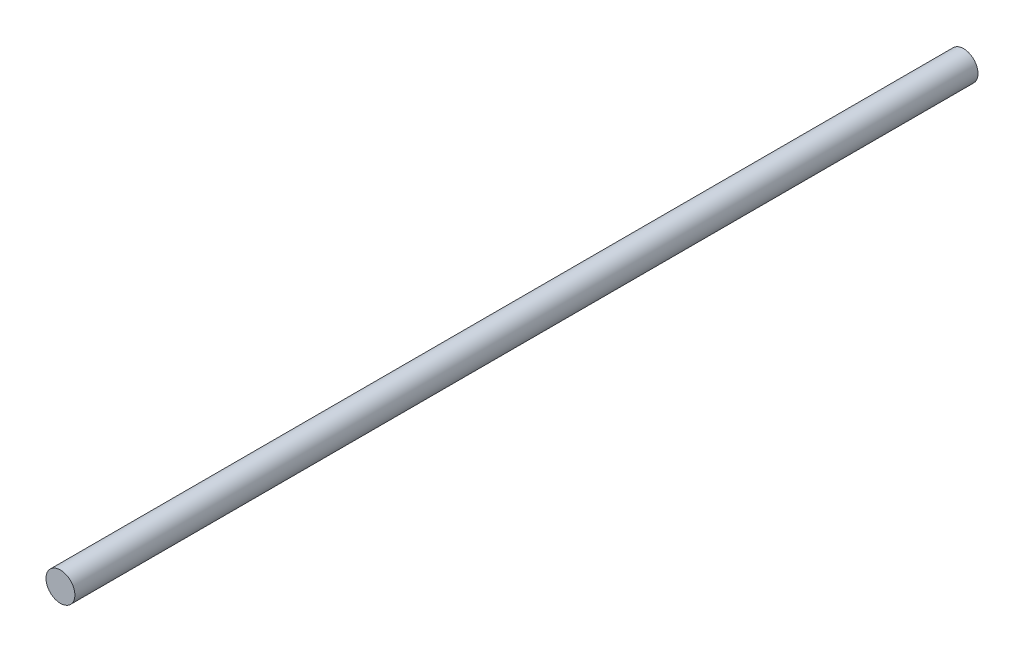
ISO-10303-21;
HEADER;
FILE_DESCRIPTION(('STEP AP214'),'2;1');
FILE_NAME('part.step','',(''),(''),'','','');
FILE_SCHEMA(('AUTOMOTIVE_DESIGN { 1 0 10303 214 1 1 1 1 }'));
ENDSEC;
DATA;
#1=APPLICATION_CONTEXT('core data for automotive mechanical design processes');
#2=APPLICATION_PROTOCOL_DEFINITION('international standard','automotive_design',2000,#1);
#3=PRODUCT_CONTEXT('',#1,'mechanical');
#4=PRODUCT('Part','Part','',(#3));
#5=PRODUCT_RELATED_PRODUCT_CATEGORY('part','',(#4));
#6=PRODUCT_DEFINITION_FORMATION('','',#4);
#7=PRODUCT_DEFINITION_CONTEXT('part definition',#1,'design');
#8=PRODUCT_DEFINITION('design','',#6,#7);
#9=PRODUCT_DEFINITION_SHAPE('','',#8);
#10=(LENGTH_UNIT() NAMED_UNIT(*) SI_UNIT(.MILLI.,.METRE.));
#11=(NAMED_UNIT(*) PLANE_ANGLE_UNIT() SI_UNIT($,.RADIAN.));
#12=(NAMED_UNIT(*) SI_UNIT($,.STERADIAN.) SOLID_ANGLE_UNIT());
#13=UNCERTAINTY_MEASURE_WITH_UNIT(LENGTH_MEASURE(1.E-05),#10,'distance_accuracy_value','');
#14=(GEOMETRIC_REPRESENTATION_CONTEXT(3) GLOBAL_UNCERTAINTY_ASSIGNED_CONTEXT((#13)) GLOBAL_UNIT_ASSIGNED_CONTEXT((#10,
#11,#12)) REPRESENTATION_CONTEXT('',''));
#15=CARTESIAN_POINT('',(0.,0.,0.));
#16=DIRECTION('',(0.,0.,1.));
#17=DIRECTION('',(1.,0.,0.));
#18=AXIS2_PLACEMENT_3D('',#15,#16,#17);
#19=CARTESIAN_POINT('',(0.,0.,250.));
#20=DIRECTION('',(0.,0.,-1.));
#21=DIRECTION('',(-1.,0.,0.));
#22=AXIS2_PLACEMENT_3D('',#19,#20,#21);
#23=CYLINDRICAL_SURFACE('',#22,4.);
#24=CARTESIAN_POINT('',(0.,0.,250.));
#25=DIRECTION('',(0.,0.,1.));
#26=DIRECTION('',(1.,0.,0.));
#27=AXIS2_PLACEMENT_3D('',#24,#25,#26);
#28=CIRCLE('',#27,4.);
#29=CARTESIAN_POINT('',(4.,0.,250.));
#30=VERTEX_POINT('',#29);
#31=EDGE_CURVE('E10',#30,#30,#28,.T.);
#32=ORIENTED_EDGE('',*,*,#31,.F.);
#33=EDGE_LOOP('',(#32));
#34=FACE_BOUND('',#33,.T.);
#35=CARTESIAN_POINT('',(0.,0.,0.));
#36=DIRECTION('',(0.,0.,1.));
#37=DIRECTION('',(1.,0.,0.));
#38=AXIS2_PLACEMENT_3D('',#35,#36,#37);
#39=CIRCLE('',#38,4.);
#40=CARTESIAN_POINT('',(4.,0.,0.));
#41=VERTEX_POINT('',#40);
#42=EDGE_CURVE('E39',#41,#41,#39,.T.);
#43=ORIENTED_EDGE('',*,*,#42,.T.);
#44=EDGE_LOOP('',(#43));
#45=FACE_BOUND('',#44,.T.);
#46=ADVANCED_FACE('F36',(#34,#45),#23,.T.);
#47=CARTESIAN_POINT('',(0.,0.,250.));
#48=DIRECTION('',(0.,0.,1.));
#49=DIRECTION('',(1.,0.,0.));
#50=AXIS2_PLACEMENT_3D('',#47,#48,#49);
#51=PLANE('',#50);
#52=ORIENTED_EDGE('',*,*,#31,.T.);
#53=EDGE_LOOP('',(#52));
#54=FACE_BOUND('',#53,.T.);
#55=ADVANCED_FACE('F51',(#54),#51,.T.);
#56=CARTESIAN_POINT('',(0.,0.,0.));
#57=DIRECTION('',(0.,0.,1.));
#58=DIRECTION('',(1.,0.,0.));
#59=AXIS2_PLACEMENT_3D('',#56,#57,#58);
#60=PLANE('',#59);
#61=ORIENTED_EDGE('',*,*,#42,.F.);
#62=EDGE_LOOP('',(#61));
#63=FACE_BOUND('',#62,.T.);
#64=ADVANCED_FACE('F49',(#63),#60,.F.);
#65=CLOSED_SHELL('',(#46,#55,#64));
#66=MANIFOLD_SOLID_BREP('B2',#65);
#67=ADVANCED_BREP_SHAPE_REPRESENTATION('',(#18,#66),#14);
#68=SHAPE_DEFINITION_REPRESENTATION(#9,#67);
ENDSEC;
END-ISO-10303-21;
